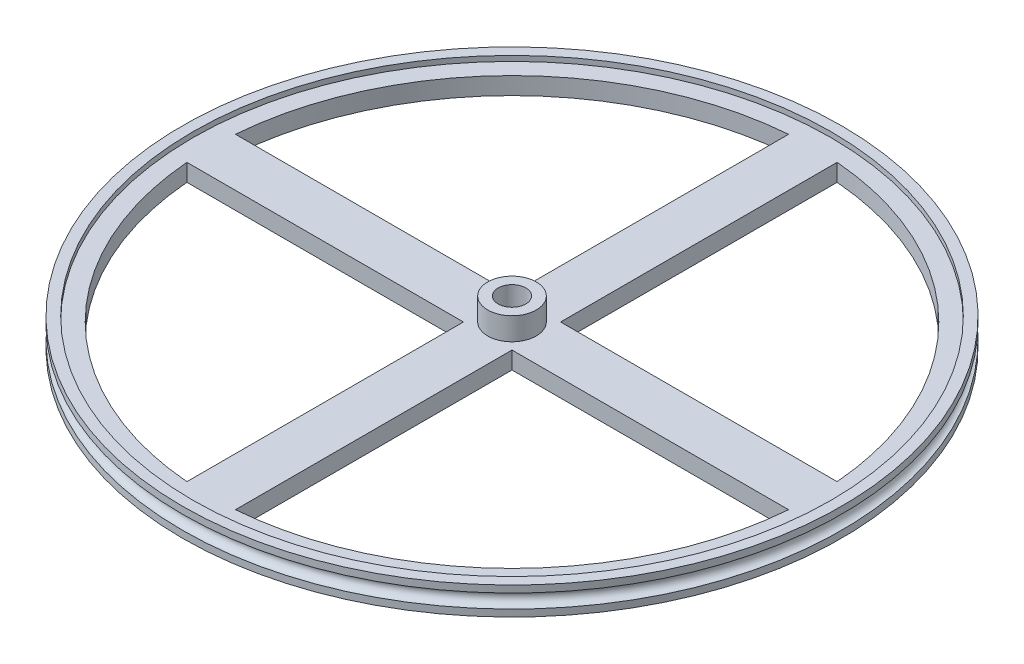
ISO-10303-21;
HEADER;
FILE_DESCRIPTION(('STEP AP214'),'2;1');
FILE_NAME('part.step','',(''),(''),'','','');
FILE_SCHEMA(('AUTOMOTIVE_DESIGN { 1 0 10303 214 1 1 1 1 }'));
ENDSEC;
DATA;
#1=APPLICATION_CONTEXT('core data for automotive mechanical design processes');
#2=APPLICATION_PROTOCOL_DEFINITION('international standard','automotive_design',2000,#1);
#3=PRODUCT_CONTEXT('',#1,'mechanical');
#4=PRODUCT('Part','Part','',(#3));
#5=PRODUCT_RELATED_PRODUCT_CATEGORY('part','',(#4));
#6=PRODUCT_DEFINITION_FORMATION('','',#4);
#7=PRODUCT_DEFINITION_CONTEXT('part definition',#1,'design');
#8=PRODUCT_DEFINITION('design','',#6,#7);
#9=PRODUCT_DEFINITION_SHAPE('','',#8);
#10=(LENGTH_UNIT() NAMED_UNIT(*) SI_UNIT(.MILLI.,.METRE.));
#11=(NAMED_UNIT(*) PLANE_ANGLE_UNIT() SI_UNIT($,.RADIAN.));
#12=(NAMED_UNIT(*) SI_UNIT($,.STERADIAN.) SOLID_ANGLE_UNIT());
#13=UNCERTAINTY_MEASURE_WITH_UNIT(LENGTH_MEASURE(1.E-05),#10,'distance_accuracy_value','');
#14=(GEOMETRIC_REPRESENTATION_CONTEXT(3) GLOBAL_UNCERTAINTY_ASSIGNED_CONTEXT((#13)) GLOBAL_UNIT_ASSIGNED_CONTEXT((#10,
#11,#12)) REPRESENTATION_CONTEXT('',''));
#15=CARTESIAN_POINT('',(0.,0.,0.));
#16=DIRECTION('',(0.,0.,1.));
#17=DIRECTION('',(1.,0.,0.));
#18=AXIS2_PLACEMENT_3D('',#15,#16,#17);
#19=CARTESIAN_POINT('',(0.,60.3176149731932,0.));
#20=DIRECTION('',(0.,1.,0.));
#21=DIRECTION('',(0.,0.,1.));
#22=AXIS2_PLACEMENT_3D('',#19,#20,#21);
#23=CYLINDRICAL_SURFACE('',#22,14.);
#24=CARTESIAN_POINT('',(0.,18.,0.));
#25=DIRECTION('',(0.,1.,0.));
#26=DIRECTION('',(0.,0.,1.));
#27=AXIS2_PLACEMENT_3D('',#24,#25,#26);
#28=CIRCLE('',#27,14.);
#29=CARTESIAN_POINT('',(0.,18.,14.));
#30=VERTEX_POINT('',#29);
#31=EDGE_CURVE('E11',#30,#30,#28,.T.);
#32=ORIENTED_EDGE('',*,*,#31,.F.);
#33=EDGE_LOOP('',(#32));
#34=FACE_BOUND('',#33,.T.);
#35=CARTESIAN_POINT('',(0.,5.,0.));
#36=DIRECTION('',(0.,1.,0.));
#37=DIRECTION('',(0.,0.,1.));
#38=AXIS2_PLACEMENT_3D('',#35,#36,#37);
#39=CIRCLE('',#38,14.);
#40=CARTESIAN_POINT('',(0.,5.,14.));
#41=VERTEX_POINT('',#40);
#42=EDGE_CURVE('E211',#41,#41,#39,.T.);
#43=ORIENTED_EDGE('',*,*,#42,.T.);
#44=EDGE_LOOP('',(#43));
#45=FACE_BOUND('',#44,.T.);
#46=ADVANCED_FACE('F32',(#34,#45),#23,.T.);
#47=CARTESIAN_POINT('',(8.00000000000001,18.,0.));
#48=DIRECTION('',(0.,-1.,0.));
#49=DIRECTION('',(0.,0.,-1.));
#50=AXIS2_PLACEMENT_3D('',#47,#48,#49);
#51=PLANE('',#50);
#52=CARTESIAN_POINT('',(0.,18.,0.));
#53=DIRECTION('',(0.,1.,0.));
#54=DIRECTION('',(0.,0.,1.));
#55=AXIS2_PLACEMENT_3D('',#52,#53,#54);
#56=CIRCLE('',#55,8.00000000000001);
#57=CARTESIAN_POINT('',(0.,18.,8.00000000000001));
#58=VERTEX_POINT('',#57);
#59=EDGE_CURVE('E39',#58,#58,#56,.T.);
#60=ORIENTED_EDGE('',*,*,#59,.F.);
#61=EDGE_LOOP('',(#60));
#62=FACE_BOUND('',#61,.T.);
#63=ORIENTED_EDGE('',*,*,#31,.T.);
#64=EDGE_LOOP('',(#63));
#65=FACE_BOUND('',#64,.T.);
#66=ADVANCED_FACE('F251',(#62,#65),#51,.F.);
#67=CARTESIAN_POINT('',(0.,60.3176149731932,0.));
#68=DIRECTION('',(0.,1.,0.));
#69=DIRECTION('',(0.,0.,1.));
#70=AXIS2_PLACEMENT_3D('',#67,#68,#69);
#71=CYLINDRICAL_SURFACE('',#70,8.00000000000001);
#72=CARTESIAN_POINT('',(0.,-8.,0.));
#73=DIRECTION('',(0.,1.,0.));
#74=DIRECTION('',(0.,0.,1.));
#75=AXIS2_PLACEMENT_3D('',#72,#73,#74);
#76=CIRCLE('',#75,8.00000000000001);
#77=CARTESIAN_POINT('',(0.,-8.,8.00000000000001));
#78=VERTEX_POINT('',#77);
#79=EDGE_CURVE('E244',#78,#78,#76,.T.);
#80=ORIENTED_EDGE('',*,*,#79,.F.);
#81=EDGE_LOOP('',(#80));
#82=FACE_BOUND('',#81,.T.);
#83=ORIENTED_EDGE('',*,*,#59,.T.);
#84=EDGE_LOOP('',(#83));
#85=FACE_BOUND('',#84,.T.);
#86=ADVANCED_FACE('F249',(#82,#85),#71,.F.);
#87=CARTESIAN_POINT('',(8.00000000000001,-8.,0.));
#88=DIRECTION('',(0.,1.,0.));
#89=DIRECTION('',(0.,0.,1.));
#90=AXIS2_PLACEMENT_3D('',#87,#88,#89);
#91=PLANE('',#90);
#92=CARTESIAN_POINT('',(0.,-8.,0.));
#93=DIRECTION('',(0.,1.,0.));
#94=DIRECTION('',(0.,0.,1.));
#95=AXIS2_PLACEMENT_3D('',#92,#93,#94);
#96=CIRCLE('',#95,14.);
#97=CARTESIAN_POINT('',(0.,-8.,14.));
#98=VERTEX_POINT('',#97);
#99=EDGE_CURVE('E241',#98,#98,#96,.T.);
#100=ORIENTED_EDGE('',*,*,#99,.F.);
#101=EDGE_LOOP('',(#100));
#102=FACE_BOUND('',#101,.T.);
#103=ORIENTED_EDGE('',*,*,#79,.T.);
#104=EDGE_LOOP('',(#103));
#105=FACE_BOUND('',#104,.T.);
#106=ADVANCED_FACE('F318',(#102,#105),#91,.F.);
#107=CARTESIAN_POINT('',(0.,60.3176149731932,0.));
#108=DIRECTION('',(0.,1.,0.));
#109=DIRECTION('',(0.,0.,1.));
#110=AXIS2_PLACEMENT_3D('',#107,#108,#109);
#111=CYLINDRICAL_SURFACE('',#110,14.);
#112=CARTESIAN_POINT('',(0.,-5.,0.));
#113=DIRECTION('',(0.,1.,0.));
#114=DIRECTION('',(0.,0.,1.));
#115=AXIS2_PLACEMENT_3D('',#112,#113,#114);
#116=CIRCLE('',#115,14.);
#117=CARTESIAN_POINT('',(0.,-5.,14.));
#118=VERTEX_POINT('',#117);
#119=EDGE_CURVE('E238',#118,#118,#116,.T.);
#120=ORIENTED_EDGE('',*,*,#119,.F.);
#121=EDGE_LOOP('',(#120));
#122=FACE_BOUND('',#121,.T.);
#123=ORIENTED_EDGE('',*,*,#99,.T.);
#124=EDGE_LOOP('',(#123));
#125=FACE_BOUND('',#124,.T.);
#126=ADVANCED_FACE('F311',(#122,#125),#111,.T.);
#127=CARTESIAN_POINT('',(14.,-5.,0.));
#128=DIRECTION('',(0.,1.,0.));
#129=DIRECTION('',(0.,0.,1.));
#130=AXIS2_PLACEMENT_3D('',#127,#128,#129);
#131=PLANE('',#130);
#132=DIRECTION('',(0.,0.,-1.));
#133=VECTOR('',#132,1.);
#134=CARTESIAN_POINT('',(14.,-5.,173.43586710943));
#135=LINE('',#134,#133);
#136=CARTESIAN_POINT('',(14.,-5.,173.43586710943));
#137=VERTEX_POINT('',#136);
#138=CARTESIAN_POINT('',(14.,-5.,14.));
#139=VERTEX_POINT('',#138);
#140=EDGE_CURVE('E125',#137,#139,#135,.T.);
#141=ORIENTED_EDGE('',*,*,#140,.F.);
#142=CARTESIAN_POINT('',(0.,-5.,0.));
#143=DIRECTION('',(0.,1.,0.));
#144=DIRECTION('',(0.,0.,1.));
#145=AXIS2_PLACEMENT_3D('',#142,#143,#144);
#146=CIRCLE('',#145,174.);
#147=CARTESIAN_POINT('',(173.43586710943,-5.,14.));
#148=VERTEX_POINT('',#147);
#149=EDGE_CURVE('E145',#148,#137,#146,.F.);
#150=ORIENTED_EDGE('',*,*,#149,.F.);
#151=DIRECTION('',(1.,0.,0.));
#152=VECTOR('',#151,1.);
#153=CARTESIAN_POINT('',(14.,-5.,14.));
#154=LINE('',#153,#152);
#155=EDGE_CURVE('E142',#139,#148,#154,.T.);
#156=ORIENTED_EDGE('',*,*,#155,.F.);
#157=EDGE_LOOP('',(#141,#150,#156));
#158=FACE_BOUND('',#157,.T.);
#159=DIRECTION('',(0.,0.,1.));
#160=VECTOR('',#159,1.);
#161=CARTESIAN_POINT('',(-14.,-5.,-14.));
#162=LINE('',#161,#160);
#163=CARTESIAN_POINT('',(-14.,-5.,-173.43586710943));
#164=VERTEX_POINT('',#163);
#165=CARTESIAN_POINT('',(-14.,-5.,-14.));
#166=VERTEX_POINT('',#165);
#167=EDGE_CURVE('E146',#164,#166,#162,.T.);
#168=ORIENTED_EDGE('',*,*,#167,.F.);
#169=CARTESIAN_POINT('',(0.,-5.,0.));
#170=DIRECTION('',(0.,1.,0.));
#171=DIRECTION('',(0.,0.,1.));
#172=AXIS2_PLACEMENT_3D('',#169,#170,#171);
#173=CIRCLE('',#172,174.);
#174=CARTESIAN_POINT('',(-173.43586710943,-5.,-14.));
#175=VERTEX_POINT('',#174);
#176=EDGE_CURVE('E149',#175,#164,#173,.F.);
#177=ORIENTED_EDGE('',*,*,#176,.F.);
#178=DIRECTION('',(-1.,0.,0.));
#179=VECTOR('',#178,1.);
#180=CARTESIAN_POINT('',(-173.43586710943,-5.,-14.));
#181=LINE('',#180,#179);
#182=EDGE_CURVE('E152',#166,#175,#181,.T.);
#183=ORIENTED_EDGE('',*,*,#182,.F.);
#184=EDGE_LOOP('',(#168,#177,#183));
#185=FACE_BOUND('',#184,.T.);
#186=DIRECTION('',(0.,0.,-1.));
#187=VECTOR('',#186,1.);
#188=CARTESIAN_POINT('',(14.,-5.,-14.));
#189=LINE('',#188,#187);
#190=CARTESIAN_POINT('',(14.,-5.,-14.));
#191=VERTEX_POINT('',#190);
#192=CARTESIAN_POINT('',(14.,-5.,-173.43586710943));
#193=VERTEX_POINT('',#192);
#194=EDGE_CURVE('E168',#191,#193,#189,.T.);
#195=ORIENTED_EDGE('',*,*,#194,.F.);
#196=DIRECTION('',(-1.,0.,0.));
#197=VECTOR('',#196,1.);
#198=CARTESIAN_POINT('',(14.,-5.,-14.));
#199=LINE('',#198,#197);
#200=CARTESIAN_POINT('',(173.43586710943,-5.,-14.));
#201=VERTEX_POINT('',#200);
#202=EDGE_CURVE('E171',#201,#191,#199,.T.);
#203=ORIENTED_EDGE('',*,*,#202,.F.);
#204=CARTESIAN_POINT('',(0.,-5.,0.));
#205=DIRECTION('',(0.,1.,0.));
#206=DIRECTION('',(0.,0.,1.));
#207=AXIS2_PLACEMENT_3D('',#204,#205,#206);
#208=CIRCLE('',#207,174.);
#209=EDGE_CURVE('E174',#193,#201,#208,.F.);
#210=ORIENTED_EDGE('',*,*,#209,.F.);
#211=EDGE_LOOP('',(#195,#203,#210));
#212=FACE_BOUND('',#211,.T.);
#213=CARTESIAN_POINT('',(0.,-5.,0.));
#214=DIRECTION('',(0.,1.,0.));
#215=DIRECTION('',(0.,0.,1.));
#216=AXIS2_PLACEMENT_3D('',#213,#214,#215);
#217=CIRCLE('',#216,174.);
#218=CARTESIAN_POINT('',(-14.,-5.,173.43586710943));
#219=VERTEX_POINT('',#218);
#220=CARTESIAN_POINT('',(-173.43586710943,-5.,14.));
#221=VERTEX_POINT('',#220);
#222=EDGE_CURVE('E190',#219,#221,#217,.F.);
#223=ORIENTED_EDGE('',*,*,#222,.F.);
#224=DIRECTION('',(0.,0.,1.));
#225=VECTOR('',#224,1.);
#226=CARTESIAN_POINT('',(-14.,-5.,173.43586710943));
#227=LINE('',#226,#225);
#228=CARTESIAN_POINT('',(-14.,-5.,14.));
#229=VERTEX_POINT('',#228);
#230=EDGE_CURVE('E193',#229,#219,#227,.T.);
#231=ORIENTED_EDGE('',*,*,#230,.F.);
#232=DIRECTION('',(1.,0.,0.));
#233=VECTOR('',#232,1.);
#234=CARTESIAN_POINT('',(-173.43586710943,-5.,14.));
#235=LINE('',#234,#233);
#236=EDGE_CURVE('E196',#221,#229,#235,.T.);
#237=ORIENTED_EDGE('',*,*,#236,.F.);
#238=EDGE_LOOP('',(#223,#231,#237));
#239=FACE_BOUND('',#238,.T.);
#240=CARTESIAN_POINT('',(0.,-5.,0.));
#241=DIRECTION('',(0.,1.,0.));
#242=DIRECTION('',(0.,0.,1.));
#243=AXIS2_PLACEMENT_3D('',#240,#241,#242);
#244=CIRCLE('',#243,184.);
#245=CARTESIAN_POINT('',(0.,-5.,184.));
#246=VERTEX_POINT('',#245);
#247=EDGE_CURVE('E235',#246,#246,#244,.T.);
#248=ORIENTED_EDGE('',*,*,#247,.F.);
#249=EDGE_LOOP('',(#248));
#250=FACE_BOUND('',#249,.T.);
#251=ORIENTED_EDGE('',*,*,#119,.T.);
#252=EDGE_LOOP('',(#251));
#253=FACE_BOUND('',#252,.T.);
#254=ADVANCED_FACE('F305',(#158,#185,#212,#239,#250,#253),#131,.F.);
#255=CARTESIAN_POINT('',(0.,60.3176149731932,0.));
#256=DIRECTION('',(0.,1.,0.));
#257=DIRECTION('',(0.,0.,1.));
#258=AXIS2_PLACEMENT_3D('',#255,#256,#257);
#259=CYLINDRICAL_SURFACE('',#258,184.);
#260=CARTESIAN_POINT('',(0.,-8.,0.));
#261=DIRECTION('',(0.,1.,0.));
#262=DIRECTION('',(0.,0.,1.));
#263=AXIS2_PLACEMENT_3D('',#260,#261,#262);
#264=CIRCLE('',#263,184.);
#265=CARTESIAN_POINT('',(0.,-8.,184.));
#266=VERTEX_POINT('',#265);
#267=EDGE_CURVE('E232',#266,#266,#264,.T.);
#268=ORIENTED_EDGE('',*,*,#267,.F.);
#269=EDGE_LOOP('',(#268));
#270=FACE_BOUND('',#269,.T.);
#271=ORIENTED_EDGE('',*,*,#247,.T.);
#272=EDGE_LOOP('',(#271));
#273=FACE_BOUND('',#272,.T.);
#274=ADVANCED_FACE('F299',(#270,#273),#259,.F.);
#275=CARTESIAN_POINT('',(184.,-8.,0.));
#276=DIRECTION('',(0.,1.,0.));
#277=DIRECTION('',(0.,0.,1.));
#278=AXIS2_PLACEMENT_3D('',#275,#276,#277);
#279=PLANE('',#278);
#280=CARTESIAN_POINT('',(0.,-8.,0.));
#281=DIRECTION('',(0.,1.,0.));
#282=DIRECTION('',(0.,0.,1.));
#283=AXIS2_PLACEMENT_3D('',#280,#281,#282);
#284=CIRCLE('',#283,190.);
#285=CARTESIAN_POINT('',(0.,-8.,190.));
#286=VERTEX_POINT('',#285);
#287=EDGE_CURVE('E229',#286,#286,#284,.T.);
#288=ORIENTED_EDGE('',*,*,#287,.F.);
#289=EDGE_LOOP('',(#288));
#290=FACE_BOUND('',#289,.T.);
#291=ORIENTED_EDGE('',*,*,#267,.T.);
#292=EDGE_LOOP('',(#291));
#293=FACE_BOUND('',#292,.T.);
#294=ADVANCED_FACE('F293',(#290,#293),#279,.F.);
#295=CARTESIAN_POINT('',(0.,60.3176149731932,0.));
#296=DIRECTION('',(0.,1.,0.));
#297=DIRECTION('',(0.,0.,1.));
#298=AXIS2_PLACEMENT_3D('',#295,#296,#297);
#299=CYLINDRICAL_SURFACE('',#298,190.);
#300=CARTESIAN_POINT('',(0.,-4.,0.));
#301=DIRECTION('',(0.,1.,0.));
#302=DIRECTION('',(0.,0.,1.));
#303=AXIS2_PLACEMENT_3D('',#300,#301,#302);
#304=CIRCLE('',#303,190.);
#305=CARTESIAN_POINT('',(0.,-4.,190.));
#306=VERTEX_POINT('',#305);
#307=EDGE_CURVE('E226',#306,#306,#304,.T.);
#308=ORIENTED_EDGE('',*,*,#307,.F.);
#309=EDGE_LOOP('',(#308));
#310=FACE_BOUND('',#309,.T.);
#311=ORIENTED_EDGE('',*,*,#287,.T.);
#312=EDGE_LOOP('',(#311));
#313=FACE_BOUND('',#312,.T.);
#314=ADVANCED_FACE('F287',(#310,#313),#299,.T.);
#315=CARTESIAN_POINT('',(0.,0.,0.));
#316=DIRECTION('',(0.,1.,0.));
#317=DIRECTION('',(0.,0.,1.));
#318=AXIS2_PLACEMENT_3D('',#315,#316,#317);
#319=TOROIDAL_SURFACE('',#318,190.,3.99999999999999);
#320=CARTESIAN_POINT('',(0.,3.99999999999999,0.));
#321=DIRECTION('',(0.,1.,0.));
#322=DIRECTION('',(0.,0.,1.));
#323=AXIS2_PLACEMENT_3D('',#320,#321,#322);
#324=CIRCLE('',#323,190.);
#325=CARTESIAN_POINT('',(0.,3.99999999999999,190.));
#326=VERTEX_POINT('',#325);
#327=EDGE_CURVE('E223',#326,#326,#324,.T.);
#328=ORIENTED_EDGE('',*,*,#327,.F.);
#329=EDGE_LOOP('',(#328));
#330=FACE_BOUND('',#329,.T.);
#331=ORIENTED_EDGE('',*,*,#307,.T.);
#332=EDGE_LOOP('',(#331));
#333=FACE_BOUND('',#332,.T.);
#334=ADVANCED_FACE('F281',(#330,#333),#319,.F.);
#335=CARTESIAN_POINT('',(0.,60.3176149731932,0.));
#336=DIRECTION('',(0.,1.,0.));
#337=DIRECTION('',(0.,0.,1.));
#338=AXIS2_PLACEMENT_3D('',#335,#336,#337);
#339=CYLINDRICAL_SURFACE('',#338,190.);
#340=CARTESIAN_POINT('',(0.,8.,0.));
#341=DIRECTION('',(0.,1.,0.));
#342=DIRECTION('',(0.,0.,1.));
#343=AXIS2_PLACEMENT_3D('',#340,#341,#342);
#344=CIRCLE('',#343,190.);
#345=CARTESIAN_POINT('',(0.,8.,190.));
#346=VERTEX_POINT('',#345);
#347=EDGE_CURVE('E220',#346,#346,#344,.T.);
#348=ORIENTED_EDGE('',*,*,#347,.F.);
#349=EDGE_LOOP('',(#348));
#350=FACE_BOUND('',#349,.T.);
#351=ORIENTED_EDGE('',*,*,#327,.T.);
#352=EDGE_LOOP('',(#351));
#353=FACE_BOUND('',#352,.T.);
#354=ADVANCED_FACE('F275',(#350,#353),#339,.T.);
#355=CARTESIAN_POINT('',(184.,8.,0.));
#356=DIRECTION('',(0.,-1.,0.));
#357=DIRECTION('',(0.,0.,-1.));
#358=AXIS2_PLACEMENT_3D('',#355,#356,#357);
#359=PLANE('',#358);
#360=CARTESIAN_POINT('',(0.,8.,0.));
#361=DIRECTION('',(0.,1.,0.));
#362=DIRECTION('',(0.,0.,1.));
#363=AXIS2_PLACEMENT_3D('',#360,#361,#362);
#364=CIRCLE('',#363,184.);
#365=CARTESIAN_POINT('',(0.,8.,184.));
#366=VERTEX_POINT('',#365);
#367=EDGE_CURVE('E217',#366,#366,#364,.T.);
#368=ORIENTED_EDGE('',*,*,#367,.F.);
#369=EDGE_LOOP('',(#368));
#370=FACE_BOUND('',#369,.T.);
#371=ORIENTED_EDGE('',*,*,#347,.T.);
#372=EDGE_LOOP('',(#371));
#373=FACE_BOUND('',#372,.T.);
#374=ADVANCED_FACE('F269',(#370,#373),#359,.F.);
#375=CARTESIAN_POINT('',(0.,60.3176149731932,0.));
#376=DIRECTION('',(0.,1.,0.));
#377=DIRECTION('',(0.,0.,1.));
#378=AXIS2_PLACEMENT_3D('',#375,#376,#377);
#379=CYLINDRICAL_SURFACE('',#378,184.);
#380=CARTESIAN_POINT('',(0.,5.,0.));
#381=DIRECTION('',(0.,1.,0.));
#382=DIRECTION('',(0.,0.,1.));
#383=AXIS2_PLACEMENT_3D('',#380,#381,#382);
#384=CIRCLE('',#383,184.);
#385=CARTESIAN_POINT('',(0.,5.,184.));
#386=VERTEX_POINT('',#385);
#387=EDGE_CURVE('E214',#386,#386,#384,.T.);
#388=ORIENTED_EDGE('',*,*,#387,.F.);
#389=EDGE_LOOP('',(#388));
#390=FACE_BOUND('',#389,.T.);
#391=ORIENTED_EDGE('',*,*,#367,.T.);
#392=EDGE_LOOP('',(#391));
#393=FACE_BOUND('',#392,.T.);
#394=ADVANCED_FACE('F263',(#390,#393),#379,.F.);
#395=CARTESIAN_POINT('',(14.,5.,0.));
#396=DIRECTION('',(0.,-1.,0.));
#397=DIRECTION('',(0.,0.,-1.));
#398=AXIS2_PLACEMENT_3D('',#395,#396,#397);
#399=PLANE('',#398);
#400=DIRECTION('',(-1.,0.,0.));
#401=VECTOR('',#400,1.);
#402=CARTESIAN_POINT('',(14.,5.,14.));
#403=LINE('',#402,#401);
#404=CARTESIAN_POINT('',(173.43586710943,5.,14.));
#405=VERTEX_POINT('',#404);
#406=CARTESIAN_POINT('',(14.,5.,14.));
#407=VERTEX_POINT('',#406);
#408=EDGE_CURVE('E131',#405,#407,#403,.T.);
#409=ORIENTED_EDGE('',*,*,#408,.F.);
#410=CARTESIAN_POINT('',(0.,5.,0.));
#411=DIRECTION('',(0.,1.,0.));
#412=DIRECTION('',(0.,0.,1.));
#413=AXIS2_PLACEMENT_3D('',#410,#411,#412);
#414=CIRCLE('',#413,174.);
#415=CARTESIAN_POINT('',(14.,5.,173.43586710943));
#416=VERTEX_POINT('',#415);
#417=EDGE_CURVE('E54',#416,#405,#414,.T.);
#418=ORIENTED_EDGE('',*,*,#417,.F.);
#419=DIRECTION('',(0.,0.,1.));
#420=VECTOR('',#419,1.);
#421=CARTESIAN_POINT('',(14.,5.,173.43586710943));
#422=LINE('',#421,#420);
#423=EDGE_CURVE('E123',#407,#416,#422,.T.);
#424=ORIENTED_EDGE('',*,*,#423,.F.);
#425=EDGE_LOOP('',(#409,#418,#424));
#426=FACE_BOUND('',#425,.T.);
#427=DIRECTION('',(1.,0.,0.));
#428=VECTOR('',#427,1.);
#429=CARTESIAN_POINT('',(-173.43586710943,5.,-14.));
#430=LINE('',#429,#428);
#431=CARTESIAN_POINT('',(-173.43586710943,5.,-14.));
#432=VERTEX_POINT('',#431);
#433=CARTESIAN_POINT('',(-14.,5.,-14.));
#434=VERTEX_POINT('',#433);
#435=EDGE_CURVE('E154',#432,#434,#430,.T.);
#436=ORIENTED_EDGE('',*,*,#435,.F.);
#437=CARTESIAN_POINT('',(0.,5.,0.));
#438=DIRECTION('',(0.,1.,0.));
#439=DIRECTION('',(0.,0.,1.));
#440=AXIS2_PLACEMENT_3D('',#437,#438,#439);
#441=CIRCLE('',#440,174.);
#442=CARTESIAN_POINT('',(-14.,5.,-173.43586710943));
#443=VERTEX_POINT('',#442);
#444=EDGE_CURVE('E144',#443,#432,#441,.T.);
#445=ORIENTED_EDGE('',*,*,#444,.F.);
#446=DIRECTION('',(0.,0.,-1.));
#447=VECTOR('',#446,1.);
#448=CARTESIAN_POINT('',(-14.,5.,-14.));
#449=LINE('',#448,#447);
#450=EDGE_CURVE('E157',#434,#443,#449,.T.);
#451=ORIENTED_EDGE('',*,*,#450,.F.);
#452=EDGE_LOOP('',(#436,#445,#451));
#453=FACE_BOUND('',#452,.T.);
#454=CARTESIAN_POINT('',(0.,5.,0.));
#455=DIRECTION('',(0.,1.,0.));
#456=DIRECTION('',(0.,0.,1.));
#457=AXIS2_PLACEMENT_3D('',#454,#455,#456);
#458=CIRCLE('',#457,174.);
#459=CARTESIAN_POINT('',(173.43586710943,5.,-14.));
#460=VERTEX_POINT('',#459);
#461=CARTESIAN_POINT('',(14.,5.,-173.43586710943));
#462=VERTEX_POINT('',#461);
#463=EDGE_CURVE('E176',#460,#462,#458,.T.);
#464=ORIENTED_EDGE('',*,*,#463,.F.);
#465=DIRECTION('',(1.,0.,0.));
#466=VECTOR('',#465,1.);
#467=CARTESIAN_POINT('',(14.,5.,-14.));
#468=LINE('',#467,#466);
#469=CARTESIAN_POINT('',(14.,5.,-14.));
#470=VERTEX_POINT('',#469);
#471=EDGE_CURVE('E167',#470,#460,#468,.T.);
#472=ORIENTED_EDGE('',*,*,#471,.F.);
#473=DIRECTION('',(0.,0.,1.));
#474=VECTOR('',#473,1.);
#475=CARTESIAN_POINT('',(14.,5.,-14.));
#476=LINE('',#475,#474);
#477=EDGE_CURVE('E179',#462,#470,#476,.T.);
#478=ORIENTED_EDGE('',*,*,#477,.F.);
#479=EDGE_LOOP('',(#464,#472,#478));
#480=FACE_BOUND('',#479,.T.);
#481=DIRECTION('',(-1.,0.,0.));
#482=VECTOR('',#481,1.);
#483=CARTESIAN_POINT('',(-173.43586710943,5.,14.));
#484=LINE('',#483,#482);
#485=CARTESIAN_POINT('',(-14.,5.,14.));
#486=VERTEX_POINT('',#485);
#487=CARTESIAN_POINT('',(-173.43586710943,5.,14.));
#488=VERTEX_POINT('',#487);
#489=EDGE_CURVE('E198',#486,#488,#484,.T.);
#490=ORIENTED_EDGE('',*,*,#489,.F.);
#491=DIRECTION('',(0.,0.,-1.));
#492=VECTOR('',#491,1.);
#493=CARTESIAN_POINT('',(-14.,5.,173.43586710943));
#494=LINE('',#493,#492);
#495=CARTESIAN_POINT('',(-14.,5.,173.43586710943));
#496=VERTEX_POINT('',#495);
#497=EDGE_CURVE('E189',#496,#486,#494,.T.);
#498=ORIENTED_EDGE('',*,*,#497,.F.);
#499=CARTESIAN_POINT('',(0.,5.,0.));
#500=DIRECTION('',(0.,1.,0.));
#501=DIRECTION('',(0.,0.,1.));
#502=AXIS2_PLACEMENT_3D('',#499,#500,#501);
#503=CIRCLE('',#502,174.);
#504=EDGE_CURVE('E201',#488,#496,#503,.T.);
#505=ORIENTED_EDGE('',*,*,#504,.F.);
#506=EDGE_LOOP('',(#490,#498,#505));
#507=FACE_BOUND('',#506,.T.);
#508=ORIENTED_EDGE('',*,*,#42,.F.);
#509=EDGE_LOOP('',(#508));
#510=FACE_BOUND('',#509,.T.);
#511=ORIENTED_EDGE('',*,*,#387,.T.);
#512=EDGE_LOOP('',(#511));
#513=FACE_BOUND('',#512,.T.);
#514=ADVANCED_FACE('F135',(#426,#453,#480,#507,#510,#513),#399,.F.);
#515=CARTESIAN_POINT('',(-14.,-230.476365594871,173.43586710943));
#516=DIRECTION('',(1.,0.,0.));
#517=DIRECTION('',(0.,0.,-1.));
#518=AXIS2_PLACEMENT_3D('',#515,#516,#517);
#519=PLANE('',#518);
#520=ORIENTED_EDGE('',*,*,#230,.T.);
#521=DIRECTION('',(0.,1.,0.));
#522=VECTOR('',#521,1.);
#523=CARTESIAN_POINT('',(-14.,-230.476365594871,173.43586710943));
#524=LINE('',#523,#522);
#525=EDGE_CURVE('E194',#219,#496,#524,.T.);
#526=ORIENTED_EDGE('',*,*,#525,.T.);
#527=ORIENTED_EDGE('',*,*,#497,.T.);
#528=DIRECTION('',(0.,1.,0.));
#529=VECTOR('',#528,1.);
#530=CARTESIAN_POINT('',(-14.,-230.476365594871,14.));
#531=LINE('',#530,#529);
#532=EDGE_CURVE('E204',#229,#486,#531,.T.);
#533=ORIENTED_EDGE('',*,*,#532,.F.);
#534=EDGE_LOOP('',(#520,#526,#527,#533));
#535=FACE_BOUND('',#534,.T.);
#536=ADVANCED_FACE('F262',(#535),#519,.F.);
#537=CARTESIAN_POINT('',(0.,-230.476365594871,0.));
#538=DIRECTION('',(0.,1.,0.));
#539=DIRECTION('',(0.,0.,1.));
#540=AXIS2_PLACEMENT_3D('',#537,#538,#539);
#541=CYLINDRICAL_SURFACE('',#540,174.);
#542=ORIENTED_EDGE('',*,*,#222,.T.);
#543=DIRECTION('',(0.,1.,0.));
#544=VECTOR('',#543,1.);
#545=CARTESIAN_POINT('',(-173.43586710943,-230.476365594871,14.));
#546=LINE('',#545,#544);
#547=EDGE_CURVE('E206',#221,#488,#546,.T.);
#548=ORIENTED_EDGE('',*,*,#547,.T.);
#549=ORIENTED_EDGE('',*,*,#504,.T.);
#550=ORIENTED_EDGE('',*,*,#525,.F.);
#551=EDGE_LOOP('',(#542,#548,#549,#550));
#552=FACE_BOUND('',#551,.T.);
#553=ADVANCED_FACE('F334',(#552),#541,.F.);
#554=CARTESIAN_POINT('',(-173.43586710943,-230.476365594871,14.));
#555=DIRECTION('',(0.,0.,-1.));
#556=DIRECTION('',(-1.,0.,0.));
#557=AXIS2_PLACEMENT_3D('',#554,#555,#556);
#558=PLANE('',#557);
#559=ORIENTED_EDGE('',*,*,#236,.T.);
#560=ORIENTED_EDGE('',*,*,#532,.T.);
#561=ORIENTED_EDGE('',*,*,#489,.T.);
#562=ORIENTED_EDGE('',*,*,#547,.F.);
#563=EDGE_LOOP('',(#559,#560,#561,#562));
#564=FACE_BOUND('',#563,.T.);
#565=ADVANCED_FACE('F336',(#564),#558,.F.);
#566=CARTESIAN_POINT('',(14.,-230.476365594871,-14.));
#567=DIRECTION('',(0.,0.,1.));
#568=DIRECTION('',(1.,0.,0.));
#569=AXIS2_PLACEMENT_3D('',#566,#567,#568);
#570=PLANE('',#569);
#571=ORIENTED_EDGE('',*,*,#202,.T.);
#572=DIRECTION('',(0.,1.,0.));
#573=VECTOR('',#572,1.);
#574=CARTESIAN_POINT('',(14.,-230.476365594871,-14.));
#575=LINE('',#574,#573);
#576=EDGE_CURVE('E172',#191,#470,#575,.T.);
#577=ORIENTED_EDGE('',*,*,#576,.T.);
#578=ORIENTED_EDGE('',*,*,#471,.T.);
#579=DIRECTION('',(0.,1.,0.));
#580=VECTOR('',#579,1.);
#581=CARTESIAN_POINT('',(173.43586710943,-230.476365594871,-14.));
#582=LINE('',#581,#580);
#583=EDGE_CURVE('E182',#201,#460,#582,.T.);
#584=ORIENTED_EDGE('',*,*,#583,.F.);
#585=EDGE_LOOP('',(#571,#577,#578,#584));
#586=FACE_BOUND('',#585,.T.);
#587=ADVANCED_FACE('F339',(#586),#570,.F.);
#588=CARTESIAN_POINT('',(14.,-230.476365594871,-14.));
#589=DIRECTION('',(-1.,0.,0.));
#590=DIRECTION('',(0.,0.,1.));
#591=AXIS2_PLACEMENT_3D('',#588,#589,#590);
#592=PLANE('',#591);
#593=ORIENTED_EDGE('',*,*,#194,.T.);
#594=DIRECTION('',(0.,1.,0.));
#595=VECTOR('',#594,1.);
#596=CARTESIAN_POINT('',(14.,-230.476365594871,-173.43586710943));
#597=LINE('',#596,#595);
#598=EDGE_CURVE('E184',#193,#462,#597,.T.);
#599=ORIENTED_EDGE('',*,*,#598,.T.);
#600=ORIENTED_EDGE('',*,*,#477,.T.);
#601=ORIENTED_EDGE('',*,*,#576,.F.);
#602=EDGE_LOOP('',(#593,#599,#600,#601));
#603=FACE_BOUND('',#602,.T.);
#604=ADVANCED_FACE('F346',(#603),#592,.F.);
#605=CARTESIAN_POINT('',(0.,-230.476365594871,0.));
#606=DIRECTION('',(0.,1.,0.));
#607=DIRECTION('',(0.,0.,1.));
#608=AXIS2_PLACEMENT_3D('',#605,#606,#607);
#609=CYLINDRICAL_SURFACE('',#608,174.);
#610=ORIENTED_EDGE('',*,*,#209,.T.);
#611=ORIENTED_EDGE('',*,*,#583,.T.);
#612=ORIENTED_EDGE('',*,*,#463,.T.);
#613=ORIENTED_EDGE('',*,*,#598,.F.);
#614=EDGE_LOOP('',(#610,#611,#612,#613));
#615=FACE_BOUND('',#614,.T.);
#616=ADVANCED_FACE('F348',(#615),#609,.F.);
#617=CARTESIAN_POINT('',(0.,-230.476365594871,0.));
#618=DIRECTION('',(0.,1.,0.));
#619=DIRECTION('',(0.,0.,1.));
#620=AXIS2_PLACEMENT_3D('',#617,#618,#619);
#621=CYLINDRICAL_SURFACE('',#620,174.);
#622=ORIENTED_EDGE('',*,*,#176,.T.);
#623=DIRECTION('',(0.,1.,0.));
#624=VECTOR('',#623,1.);
#625=CARTESIAN_POINT('',(-14.,-230.476365594871,-173.43586710943));
#626=LINE('',#625,#624);
#627=EDGE_CURVE('E150',#164,#443,#626,.T.);
#628=ORIENTED_EDGE('',*,*,#627,.T.);
#629=ORIENTED_EDGE('',*,*,#444,.T.);
#630=DIRECTION('',(0.,1.,0.));
#631=VECTOR('',#630,1.);
#632=CARTESIAN_POINT('',(-173.43586710943,-230.476365594871,-14.));
#633=LINE('',#632,#631);
#634=EDGE_CURVE('E160',#175,#432,#633,.T.);
#635=ORIENTED_EDGE('',*,*,#634,.F.);
#636=EDGE_LOOP('',(#622,#628,#629,#635));
#637=FACE_BOUND('',#636,.T.);
#638=ADVANCED_FACE('F351',(#637),#621,.F.);
#639=CARTESIAN_POINT('',(-14.,-230.476365594871,-14.));
#640=DIRECTION('',(1.,0.,0.));
#641=DIRECTION('',(0.,0.,-1.));
#642=AXIS2_PLACEMENT_3D('',#639,#640,#641);
#643=PLANE('',#642);
#644=ORIENTED_EDGE('',*,*,#167,.T.);
#645=DIRECTION('',(0.,1.,0.));
#646=VECTOR('',#645,1.);
#647=CARTESIAN_POINT('',(-14.,-230.476365594871,-14.));
#648=LINE('',#647,#646);
#649=EDGE_CURVE('E162',#166,#434,#648,.T.);
#650=ORIENTED_EDGE('',*,*,#649,.T.);
#651=ORIENTED_EDGE('',*,*,#450,.T.);
#652=ORIENTED_EDGE('',*,*,#627,.F.);
#653=EDGE_LOOP('',(#644,#650,#651,#652));
#654=FACE_BOUND('',#653,.T.);
#655=ADVANCED_FACE('F358',(#654),#643,.F.);
#656=CARTESIAN_POINT('',(-173.43586710943,-230.476365594871,-14.));
#657=DIRECTION('',(0.,0.,1.));
#658=DIRECTION('',(1.,0.,0.));
#659=AXIS2_PLACEMENT_3D('',#656,#657,#658);
#660=PLANE('',#659);
#661=ORIENTED_EDGE('',*,*,#182,.T.);
#662=ORIENTED_EDGE('',*,*,#634,.T.);
#663=ORIENTED_EDGE('',*,*,#435,.T.);
#664=ORIENTED_EDGE('',*,*,#649,.F.);
#665=EDGE_LOOP('',(#661,#662,#663,#664));
#666=FACE_BOUND('',#665,.T.);
#667=ADVANCED_FACE('F360',(#666),#660,.F.);
#668=CARTESIAN_POINT('',(0.,-230.476365594871,0.));
#669=DIRECTION('',(0.,1.,0.));
#670=DIRECTION('',(0.,0.,1.));
#671=AXIS2_PLACEMENT_3D('',#668,#669,#670);
#672=CYLINDRICAL_SURFACE('',#671,174.);
#673=ORIENTED_EDGE('',*,*,#149,.T.);
#674=DIRECTION('',(0.,1.,0.));
#675=VECTOR('',#674,1.);
#676=CARTESIAN_POINT('',(14.,-230.476365594871,173.43586710943));
#677=LINE('',#676,#675);
#678=EDGE_CURVE('E127',#137,#416,#677,.T.);
#679=ORIENTED_EDGE('',*,*,#678,.T.);
#680=ORIENTED_EDGE('',*,*,#417,.T.);
#681=DIRECTION('',(0.,1.,0.));
#682=VECTOR('',#681,1.);
#683=CARTESIAN_POINT('',(173.43586710943,-230.476365594871,14.));
#684=LINE('',#683,#682);
#685=EDGE_CURVE('E128',#148,#405,#684,.T.);
#686=ORIENTED_EDGE('',*,*,#685,.F.);
#687=EDGE_LOOP('',(#673,#679,#680,#686));
#688=FACE_BOUND('',#687,.T.);
#689=ADVANCED_FACE('F363',(#688),#672,.F.);
#690=CARTESIAN_POINT('',(14.,-230.476365594871,173.43586710943));
#691=DIRECTION('',(-1.,0.,0.));
#692=DIRECTION('',(0.,0.,1.));
#693=AXIS2_PLACEMENT_3D('',#690,#691,#692);
#694=PLANE('',#693);
#695=ORIENTED_EDGE('',*,*,#140,.T.);
#696=DIRECTION('',(0.,1.,0.));
#697=VECTOR('',#696,1.);
#698=CARTESIAN_POINT('',(14.,-230.476365594871,14.));
#699=LINE('',#698,#697);
#700=EDGE_CURVE('E46',#139,#407,#699,.T.);
#701=ORIENTED_EDGE('',*,*,#700,.T.);
#702=ORIENTED_EDGE('',*,*,#423,.T.);
#703=ORIENTED_EDGE('',*,*,#678,.F.);
#704=EDGE_LOOP('',(#695,#701,#702,#703));
#705=FACE_BOUND('',#704,.T.);
#706=ADVANCED_FACE('F120',(#705),#694,.F.);
#707=CARTESIAN_POINT('',(14.,-230.476365594871,14.));
#708=DIRECTION('',(0.,0.,-1.));
#709=DIRECTION('',(-1.,0.,0.));
#710=AXIS2_PLACEMENT_3D('',#707,#708,#709);
#711=PLANE('',#710);
#712=ORIENTED_EDGE('',*,*,#155,.T.);
#713=ORIENTED_EDGE('',*,*,#685,.T.);
#714=ORIENTED_EDGE('',*,*,#408,.T.);
#715=ORIENTED_EDGE('',*,*,#700,.F.);
#716=EDGE_LOOP('',(#712,#713,#714,#715));
#717=FACE_BOUND('',#716,.T.);
#718=ADVANCED_FACE('F132',(#717),#711,.F.);
#719=CLOSED_SHELL('',(#46,#66,#86,#106,#126,#254,#274,#294,#314,#334,#354,#374,#394,#514,#536,
#553,#565,#587,#604,#616,#638,#655,#667,#689,#706,#718));
#720=MANIFOLD_SOLID_BREP('B2',#719);
#721=ADVANCED_BREP_SHAPE_REPRESENTATION('',(#18,#720),#14);
#722=SHAPE_DEFINITION_REPRESENTATION(#9,#721);
ENDSEC;
END-ISO-10303-21;
